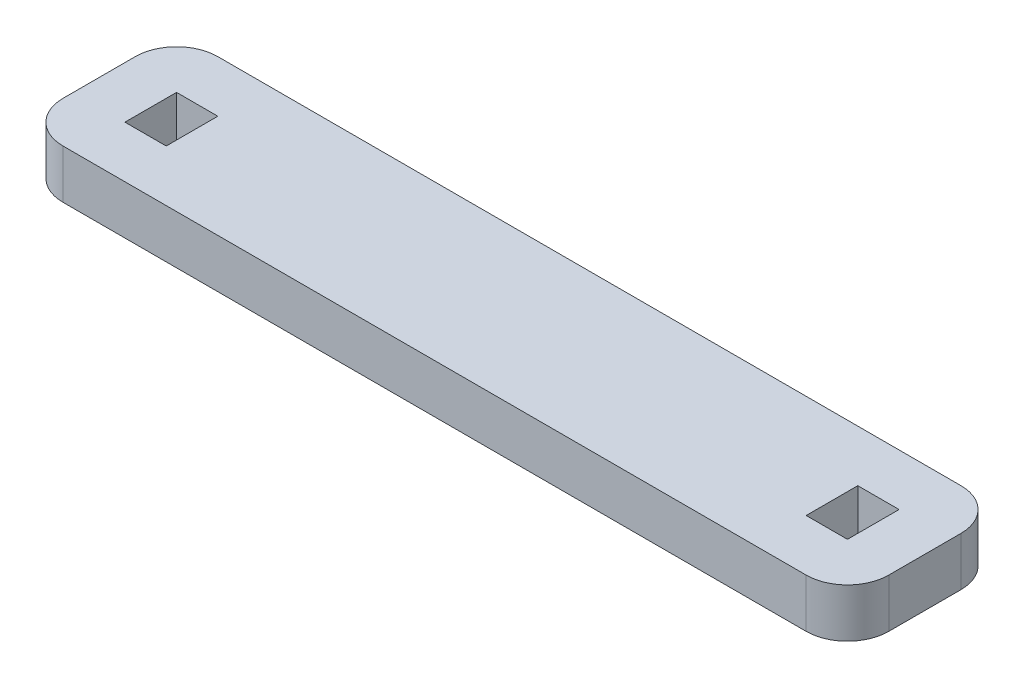
ISO-10303-21;
HEADER;
FILE_DESCRIPTION(('STEP AP214'),'2;1');
FILE_NAME('part.step','',(''),(''),'','','');
FILE_SCHEMA(('AUTOMOTIVE_DESIGN { 1 0 10303 214 1 1 1 1 }'));
ENDSEC;
DATA;
#1=APPLICATION_CONTEXT('core data for automotive mechanical design processes');
#2=APPLICATION_PROTOCOL_DEFINITION('international standard','automotive_design',2000,#1);
#3=PRODUCT_CONTEXT('',#1,'mechanical');
#4=PRODUCT('Part','Part','',(#3));
#5=PRODUCT_RELATED_PRODUCT_CATEGORY('part','',(#4));
#6=PRODUCT_DEFINITION_FORMATION('','',#4);
#7=PRODUCT_DEFINITION_CONTEXT('part definition',#1,'design');
#8=PRODUCT_DEFINITION('design','',#6,#7);
#9=PRODUCT_DEFINITION_SHAPE('','',#8);
#10=(LENGTH_UNIT() NAMED_UNIT(*) SI_UNIT(.MILLI.,.METRE.));
#11=(NAMED_UNIT(*) PLANE_ANGLE_UNIT() SI_UNIT($,.RADIAN.));
#12=(NAMED_UNIT(*) SI_UNIT($,.STERADIAN.) SOLID_ANGLE_UNIT());
#13=UNCERTAINTY_MEASURE_WITH_UNIT(LENGTH_MEASURE(1.E-05),#10,'distance_accuracy_value','');
#14=(GEOMETRIC_REPRESENTATION_CONTEXT(3) GLOBAL_UNCERTAINTY_ASSIGNED_CONTEXT((#13)) GLOBAL_UNIT_ASSIGNED_CONTEXT((#10,
#11,#12)) REPRESENTATION_CONTEXT('',''));
#15=CARTESIAN_POINT('',(0.,0.,0.));
#16=DIRECTION('',(0.,0.,1.));
#17=DIRECTION('',(1.,0.,0.));
#18=AXIS2_PLACEMENT_3D('',#15,#16,#17);
#19=CARTESIAN_POINT('',(0.,1.5,0.));
#20=DIRECTION('',(0.,1.,0.));
#21=DIRECTION('',(0.,0.,1.));
#22=AXIS2_PLACEMENT_3D('',#19,#20,#21);
#23=PLANE('',#22);
#24=DIRECTION('',(-1.,0.,0.));
#25=VECTOR('',#24,1.);
#26=CARTESIAN_POINT('',(25.4,1.5,-4.7625));
#27=LINE('',#26,#25);
#28=CARTESIAN_POINT('',(22.86,1.5,-4.7625));
#29=VERTEX_POINT('',#28);
#30=CARTESIAN_POINT('',(-22.86,1.5,-4.7625));
#31=VERTEX_POINT('',#30);
#32=EDGE_CURVE('E268',#29,#31,#27,.T.);
#33=ORIENTED_EDGE('',*,*,#32,.T.);
#34=CARTESIAN_POINT('',(-22.86,1.5,-2.2225));
#35=DIRECTION('',(0.,1.,0.));
#36=DIRECTION('',(0.,0.,1.));
#37=AXIS2_PLACEMENT_3D('',#34,#35,#36);
#38=CIRCLE('',#37,2.54);
#39=CARTESIAN_POINT('',(-25.4,1.5,-2.2225));
#40=VERTEX_POINT('',#39);
#41=EDGE_CURVE('E319',#31,#40,#38,.T.);
#42=ORIENTED_EDGE('',*,*,#41,.T.);
#43=DIRECTION('',(0.,0.,1.));
#44=VECTOR('',#43,1.);
#45=CARTESIAN_POINT('',(-25.4,1.5,4.7625));
#46=LINE('',#45,#44);
#47=CARTESIAN_POINT('',(-25.4,1.5,2.2225));
#48=VERTEX_POINT('',#47);
#49=EDGE_CURVE('E257',#40,#48,#46,.T.);
#50=ORIENTED_EDGE('',*,*,#49,.T.);
#51=CARTESIAN_POINT('',(-22.86,1.5,2.2225));
#52=DIRECTION('',(0.,1.,0.));
#53=DIRECTION('',(0.,0.,1.));
#54=AXIS2_PLACEMENT_3D('',#51,#52,#53);
#55=CIRCLE('',#54,2.54);
#56=CARTESIAN_POINT('',(-22.86,1.5,4.7625));
#57=VERTEX_POINT('',#56);
#58=EDGE_CURVE('E311',#48,#57,#55,.T.);
#59=ORIENTED_EDGE('',*,*,#58,.T.);
#60=DIRECTION('',(1.,0.,0.));
#61=VECTOR('',#60,1.);
#62=CARTESIAN_POINT('',(25.4,1.5,4.7625));
#63=LINE('',#62,#61);
#64=CARTESIAN_POINT('',(22.86,1.5,4.7625));
#65=VERTEX_POINT('',#64);
#66=EDGE_CURVE('E261',#57,#65,#63,.T.);
#67=ORIENTED_EDGE('',*,*,#66,.T.);
#68=CARTESIAN_POINT('',(22.86,1.5,2.2225));
#69=DIRECTION('',(0.,1.,0.));
#70=DIRECTION('',(0.,0.,1.));
#71=AXIS2_PLACEMENT_3D('',#68,#69,#70);
#72=CIRCLE('',#71,2.54);
#73=CARTESIAN_POINT('',(25.4,1.5,2.2225));
#74=VERTEX_POINT('',#73);
#75=EDGE_CURVE('E68',#65,#74,#72,.T.);
#76=ORIENTED_EDGE('',*,*,#75,.T.);
#77=DIRECTION('',(0.,0.,-1.));
#78=VECTOR('',#77,1.);
#79=CARTESIAN_POINT('',(25.4,1.5,4.7625));
#80=LINE('',#79,#78);
#81=CARTESIAN_POINT('',(25.4,1.5,-2.2225));
#82=VERTEX_POINT('',#81);
#83=EDGE_CURVE('E265',#74,#82,#80,.T.);
#84=ORIENTED_EDGE('',*,*,#83,.T.);
#85=CARTESIAN_POINT('',(22.86,1.5,-2.2225));
#86=DIRECTION('',(0.,1.,0.));
#87=DIRECTION('',(0.,0.,1.));
#88=AXIS2_PLACEMENT_3D('',#85,#86,#87);
#89=CIRCLE('',#88,2.54);
#90=EDGE_CURVE('E316',#82,#29,#89,.T.);
#91=ORIENTED_EDGE('',*,*,#90,.T.);
#92=EDGE_LOOP('',(#33,#42,#50,#59,#67,#76,#84,#91));
#93=FACE_BOUND('',#92,.T.);
#94=DIRECTION('',(1.,0.,0.));
#95=VECTOR('',#94,1.);
#96=CARTESIAN_POINT('',(-19.685,1.5,1.5875));
#97=LINE('',#96,#95);
#98=CARTESIAN_POINT('',(-22.225,1.5,1.5875));
#99=VERTEX_POINT('',#98);
#100=CARTESIAN_POINT('',(-19.685,1.5,1.5875));
#101=VERTEX_POINT('',#100);
#102=EDGE_CURVE('E217',#99,#101,#97,.T.);
#103=ORIENTED_EDGE('',*,*,#102,.F.);
#104=DIRECTION('',(0.,0.,1.));
#105=VECTOR('',#104,1.);
#106=CARTESIAN_POINT('',(-22.225,1.5,1.5875));
#107=LINE('',#106,#105);
#108=CARTESIAN_POINT('',(-22.225,1.5,-1.5875));
#109=VERTEX_POINT('',#108);
#110=EDGE_CURVE('E214',#109,#99,#107,.T.);
#111=ORIENTED_EDGE('',*,*,#110,.F.);
#112=DIRECTION('',(-1.,0.,0.));
#113=VECTOR('',#112,1.);
#114=CARTESIAN_POINT('',(-19.685,1.5,-1.5875));
#115=LINE('',#114,#113);
#116=CARTESIAN_POINT('',(-19.685,1.5,-1.5875));
#117=VERTEX_POINT('',#116);
#118=EDGE_CURVE('E225',#117,#109,#115,.T.);
#119=ORIENTED_EDGE('',*,*,#118,.F.);
#120=DIRECTION('',(0.,0.,-1.));
#121=VECTOR('',#120,1.);
#122=CARTESIAN_POINT('',(-19.685,1.5,1.5875));
#123=LINE('',#122,#121);
#124=EDGE_CURVE('E221',#101,#117,#123,.T.);
#125=ORIENTED_EDGE('',*,*,#124,.F.);
#126=EDGE_LOOP('',(#103,#111,#119,#125));
#127=FACE_BOUND('',#126,.T.);
#128=DIRECTION('',(1.,0.,0.));
#129=VECTOR('',#128,1.);
#130=CARTESIAN_POINT('',(22.225,1.5,1.5875));
#131=LINE('',#130,#129);
#132=CARTESIAN_POINT('',(19.685,1.5,1.5875));
#133=VERTEX_POINT('',#132);
#134=CARTESIAN_POINT('',(22.225,1.5,1.5875));
#135=VERTEX_POINT('',#134);
#136=EDGE_CURVE('E172',#133,#135,#131,.T.);
#137=ORIENTED_EDGE('',*,*,#136,.F.);
#138=DIRECTION('',(0.,0.,1.));
#139=VECTOR('',#138,1.);
#140=CARTESIAN_POINT('',(19.685,1.5,1.5875));
#141=LINE('',#140,#139);
#142=CARTESIAN_POINT('',(19.685,1.5,-1.5875));
#143=VERTEX_POINT('',#142);
#144=EDGE_CURVE('E161',#143,#133,#141,.T.);
#145=ORIENTED_EDGE('',*,*,#144,.F.);
#146=DIRECTION('',(-1.,0.,0.));
#147=VECTOR('',#146,1.);
#148=CARTESIAN_POINT('',(22.225,1.5,-1.5875));
#149=LINE('',#148,#147);
#150=CARTESIAN_POINT('',(22.225,1.5,-1.5875));
#151=VERTEX_POINT('',#150);
#152=EDGE_CURVE('E190',#151,#143,#149,.T.);
#153=ORIENTED_EDGE('',*,*,#152,.F.);
#154=DIRECTION('',(0.,0.,-1.));
#155=VECTOR('',#154,1.);
#156=CARTESIAN_POINT('',(22.225,1.5,1.5875));
#157=LINE('',#156,#155);
#158=EDGE_CURVE('E186',#135,#151,#157,.T.);
#159=ORIENTED_EDGE('',*,*,#158,.F.);
#160=EDGE_LOOP('',(#137,#145,#153,#159));
#161=FACE_BOUND('',#160,.T.);
#162=ADVANCED_FACE('F45',(#93,#127,#161),#23,.T.);
#163=CARTESIAN_POINT('',(0.,-1.5,0.));
#164=DIRECTION('',(0.,1.,0.));
#165=DIRECTION('',(0.,0.,1.));
#166=AXIS2_PLACEMENT_3D('',#163,#164,#165);
#167=PLANE('',#166);
#168=DIRECTION('',(0.,0.,1.));
#169=VECTOR('',#168,1.);
#170=CARTESIAN_POINT('',(-22.225,-1.5,1.5875));
#171=LINE('',#170,#169);
#172=CARTESIAN_POINT('',(-22.225,-1.5,-1.5875));
#173=VERTEX_POINT('',#172);
#174=CARTESIAN_POINT('',(-22.225,-1.5,1.5875));
#175=VERTEX_POINT('',#174);
#176=EDGE_CURVE('E181',#173,#175,#171,.T.);
#177=ORIENTED_EDGE('',*,*,#176,.T.);
#178=DIRECTION('',(1.,0.,0.));
#179=VECTOR('',#178,1.);
#180=CARTESIAN_POINT('',(-19.685,-1.5,1.5875));
#181=LINE('',#180,#179);
#182=CARTESIAN_POINT('',(-19.685,-1.5,1.5875));
#183=VERTEX_POINT('',#182);
#184=EDGE_CURVE('E232',#175,#183,#181,.T.);
#185=ORIENTED_EDGE('',*,*,#184,.T.);
#186=DIRECTION('',(0.,0.,-1.));
#187=VECTOR('',#186,1.);
#188=CARTESIAN_POINT('',(-19.685,-1.5,1.5875));
#189=LINE('',#188,#187);
#190=CARTESIAN_POINT('',(-19.685,-1.5,-1.5875));
#191=VERTEX_POINT('',#190);
#192=EDGE_CURVE('E236',#183,#191,#189,.T.);
#193=ORIENTED_EDGE('',*,*,#192,.T.);
#194=DIRECTION('',(-1.,0.,0.));
#195=VECTOR('',#194,1.);
#196=CARTESIAN_POINT('',(-19.685,-1.5,-1.5875));
#197=LINE('',#196,#195);
#198=EDGE_CURVE('E218',#191,#173,#197,.T.);
#199=ORIENTED_EDGE('',*,*,#198,.T.);
#200=EDGE_LOOP('',(#177,#185,#193,#199));
#201=FACE_BOUND('',#200,.T.);
#202=DIRECTION('',(0.,0.,1.));
#203=VECTOR('',#202,1.);
#204=CARTESIAN_POINT('',(-25.4,-1.5,4.7625));
#205=LINE('',#204,#203);
#206=CARTESIAN_POINT('',(-25.4,-1.5,-2.2225));
#207=VERTEX_POINT('',#206);
#208=CARTESIAN_POINT('',(-25.4,-1.5,2.2225));
#209=VERTEX_POINT('',#208);
#210=EDGE_CURVE('E256',#207,#209,#205,.T.);
#211=ORIENTED_EDGE('',*,*,#210,.F.);
#212=CARTESIAN_POINT('',(-22.86,-1.5,-2.2225));
#213=DIRECTION('',(0.,1.,0.));
#214=DIRECTION('',(0.,0.,1.));
#215=AXIS2_PLACEMENT_3D('',#212,#213,#214);
#216=CIRCLE('',#215,2.54);
#217=CARTESIAN_POINT('',(-22.86,-1.5,-4.7625));
#218=VERTEX_POINT('',#217);
#219=EDGE_CURVE('E301',#207,#218,#216,.F.);
#220=ORIENTED_EDGE('',*,*,#219,.T.);
#221=DIRECTION('',(-1.,0.,0.));
#222=VECTOR('',#221,1.);
#223=CARTESIAN_POINT('',(25.4,-1.5,-4.7625));
#224=LINE('',#223,#222);
#225=CARTESIAN_POINT('',(22.86,-1.5,-4.7625));
#226=VERTEX_POINT('',#225);
#227=EDGE_CURVE('E262',#226,#218,#224,.T.);
#228=ORIENTED_EDGE('',*,*,#227,.F.);
#229=CARTESIAN_POINT('',(22.86,-1.5,-2.2225));
#230=DIRECTION('',(0.,1.,0.));
#231=DIRECTION('',(0.,0.,1.));
#232=AXIS2_PLACEMENT_3D('',#229,#230,#231);
#233=CIRCLE('',#232,2.54);
#234=CARTESIAN_POINT('',(25.4,-1.5,-2.2225));
#235=VERTEX_POINT('',#234);
#236=EDGE_CURVE('E298',#226,#235,#233,.F.);
#237=ORIENTED_EDGE('',*,*,#236,.T.);
#238=DIRECTION('',(0.,0.,-1.));
#239=VECTOR('',#238,1.);
#240=CARTESIAN_POINT('',(25.4,-1.5,4.7625));
#241=LINE('',#240,#239);
#242=CARTESIAN_POINT('',(25.4,-1.5,2.2225));
#243=VERTEX_POINT('',#242);
#244=EDGE_CURVE('E280',#243,#235,#241,.T.);
#245=ORIENTED_EDGE('',*,*,#244,.F.);
#246=CARTESIAN_POINT('',(22.86,-1.5,2.2225));
#247=DIRECTION('',(0.,1.,0.));
#248=DIRECTION('',(0.,0.,1.));
#249=AXIS2_PLACEMENT_3D('',#246,#247,#248);
#250=CIRCLE('',#249,2.54);
#251=CARTESIAN_POINT('',(22.86,-1.5,4.7625));
#252=VERTEX_POINT('',#251);
#253=EDGE_CURVE('E295',#243,#252,#250,.F.);
#254=ORIENTED_EDGE('',*,*,#253,.T.);
#255=DIRECTION('',(1.,0.,0.));
#256=VECTOR('',#255,1.);
#257=CARTESIAN_POINT('',(25.4,-1.5,4.7625));
#258=LINE('',#257,#256);
#259=CARTESIAN_POINT('',(-22.86,-1.5,4.7625));
#260=VERTEX_POINT('',#259);
#261=EDGE_CURVE('E276',#260,#252,#258,.T.);
#262=ORIENTED_EDGE('',*,*,#261,.F.);
#263=CARTESIAN_POINT('',(-22.86,-1.5,2.2225));
#264=DIRECTION('',(0.,1.,0.));
#265=DIRECTION('',(0.,0.,1.));
#266=AXIS2_PLACEMENT_3D('',#263,#264,#265);
#267=CIRCLE('',#266,2.54);
#268=EDGE_CURVE('E292',#260,#209,#267,.F.);
#269=ORIENTED_EDGE('',*,*,#268,.T.);
#270=EDGE_LOOP('',(#211,#220,#228,#237,#245,#254,#262,#269));
#271=FACE_BOUND('',#270,.T.);
#272=DIRECTION('',(0.,0.,1.));
#273=VECTOR('',#272,1.);
#274=CARTESIAN_POINT('',(19.685,-1.5,1.5875));
#275=LINE('',#274,#273);
#276=CARTESIAN_POINT('',(19.685,-1.5,-1.5875));
#277=VERTEX_POINT('',#276);
#278=CARTESIAN_POINT('',(19.685,-1.5,1.5875));
#279=VERTEX_POINT('',#278);
#280=EDGE_CURVE('E195',#277,#279,#275,.T.);
#281=ORIENTED_EDGE('',*,*,#280,.T.);
#282=DIRECTION('',(1.,0.,0.));
#283=VECTOR('',#282,1.);
#284=CARTESIAN_POINT('',(22.225,-1.5,1.5875));
#285=LINE('',#284,#283);
#286=CARTESIAN_POINT('',(22.225,-1.5,1.5875));
#287=VERTEX_POINT('',#286);
#288=EDGE_CURVE('E179',#279,#287,#285,.T.);
#289=ORIENTED_EDGE('',*,*,#288,.T.);
#290=DIRECTION('',(0.,0.,-1.));
#291=VECTOR('',#290,1.);
#292=CARTESIAN_POINT('',(22.225,-1.5,1.5875));
#293=LINE('',#292,#291);
#294=CARTESIAN_POINT('',(22.225,-1.5,-1.5875));
#295=VERTEX_POINT('',#294);
#296=EDGE_CURVE('E200',#287,#295,#293,.T.);
#297=ORIENTED_EDGE('',*,*,#296,.T.);
#298=DIRECTION('',(-1.,0.,0.));
#299=VECTOR('',#298,1.);
#300=CARTESIAN_POINT('',(22.225,-1.5,-1.5875));
#301=LINE('',#300,#299);
#302=EDGE_CURVE('E173',#295,#277,#301,.T.);
#303=ORIENTED_EDGE('',*,*,#302,.T.);
#304=EDGE_LOOP('',(#281,#289,#297,#303));
#305=FACE_BOUND('',#304,.T.);
#306=ADVANCED_FACE('F339',(#201,#271,#305),#167,.F.);
#307=CARTESIAN_POINT('',(-25.4,1.5,4.7625));
#308=DIRECTION('',(1.,0.,0.));
#309=DIRECTION('',(0.,0.,-1.));
#310=AXIS2_PLACEMENT_3D('',#307,#308,#309);
#311=PLANE('',#310);
#312=ORIENTED_EDGE('',*,*,#49,.F.);
#313=DIRECTION('',(0.,-1.,0.));
#314=VECTOR('',#313,1.);
#315=CARTESIAN_POINT('',(-25.4,1.5,-2.2225));
#316=LINE('',#315,#314);
#317=EDGE_CURVE('E288',#40,#207,#316,.T.);
#318=ORIENTED_EDGE('',*,*,#317,.T.);
#319=ORIENTED_EDGE('',*,*,#210,.T.);
#320=DIRECTION('',(0.,-1.,0.));
#321=VECTOR('',#320,1.);
#322=CARTESIAN_POINT('',(-25.4,1.5,2.2225));
#323=LINE('',#322,#321);
#324=EDGE_CURVE('E272',#209,#48,#323,.F.);
#325=ORIENTED_EDGE('',*,*,#324,.T.);
#326=EDGE_LOOP('',(#312,#318,#319,#325));
#327=FACE_BOUND('',#326,.T.);
#328=ADVANCED_FACE('F362',(#327),#311,.F.);
#329=CARTESIAN_POINT('',(25.4,1.5,4.7625));
#330=DIRECTION('',(0.,0.,-1.));
#331=DIRECTION('',(-1.,0.,0.));
#332=AXIS2_PLACEMENT_3D('',#329,#330,#331);
#333=PLANE('',#332);
#334=ORIENTED_EDGE('',*,*,#261,.T.);
#335=DIRECTION('',(0.,-1.,0.));
#336=VECTOR('',#335,1.);
#337=CARTESIAN_POINT('',(22.86,1.5,4.7625));
#338=LINE('',#337,#336);
#339=EDGE_CURVE('E11',#252,#65,#338,.F.);
#340=ORIENTED_EDGE('',*,*,#339,.T.);
#341=ORIENTED_EDGE('',*,*,#66,.F.);
#342=DIRECTION('',(0.,-1.,0.));
#343=VECTOR('',#342,1.);
#344=CARTESIAN_POINT('',(-22.86,1.5,4.7625));
#345=LINE('',#344,#343);
#346=EDGE_CURVE('E54',#57,#260,#345,.T.);
#347=ORIENTED_EDGE('',*,*,#346,.T.);
#348=EDGE_LOOP('',(#334,#340,#341,#347));
#349=FACE_BOUND('',#348,.T.);
#350=ADVANCED_FACE('F333',(#349),#333,.F.);
#351=CARTESIAN_POINT('',(25.4,1.5,4.7625));
#352=DIRECTION('',(-1.,0.,0.));
#353=DIRECTION('',(0.,0.,1.));
#354=AXIS2_PLACEMENT_3D('',#351,#352,#353);
#355=PLANE('',#354);
#356=ORIENTED_EDGE('',*,*,#244,.T.);
#357=DIRECTION('',(0.,-1.,0.));
#358=VECTOR('',#357,1.);
#359=CARTESIAN_POINT('',(25.4,1.5,-2.2225));
#360=LINE('',#359,#358);
#361=EDGE_CURVE('E61',#235,#82,#360,.F.);
#362=ORIENTED_EDGE('',*,*,#361,.T.);
#363=ORIENTED_EDGE('',*,*,#83,.F.);
#364=DIRECTION('',(0.,-1.,0.));
#365=VECTOR('',#364,1.);
#366=CARTESIAN_POINT('',(25.4,1.5,2.2225));
#367=LINE('',#366,#365);
#368=EDGE_CURVE('E322',#74,#243,#367,.T.);
#369=ORIENTED_EDGE('',*,*,#368,.T.);
#370=EDGE_LOOP('',(#356,#362,#363,#369));
#371=FACE_BOUND('',#370,.T.);
#372=ADVANCED_FACE('F345',(#371),#355,.F.);
#373=CARTESIAN_POINT('',(25.4,1.5,-4.7625));
#374=DIRECTION('',(0.,0.,1.));
#375=DIRECTION('',(1.,0.,0.));
#376=AXIS2_PLACEMENT_3D('',#373,#374,#375);
#377=PLANE('',#376);
#378=ORIENTED_EDGE('',*,*,#227,.T.);
#379=DIRECTION('',(0.,-1.,0.));
#380=VECTOR('',#379,1.);
#381=CARTESIAN_POINT('',(-22.86,1.5,-4.7625));
#382=LINE('',#381,#380);
#383=EDGE_CURVE('E308',#218,#31,#382,.F.);
#384=ORIENTED_EDGE('',*,*,#383,.T.);
#385=ORIENTED_EDGE('',*,*,#32,.F.);
#386=DIRECTION('',(0.,-1.,0.));
#387=VECTOR('',#386,1.);
#388=CARTESIAN_POINT('',(22.86,1.5,-4.7625));
#389=LINE('',#388,#387);
#390=EDGE_CURVE('E304',#29,#226,#389,.T.);
#391=ORIENTED_EDGE('',*,*,#390,.T.);
#392=EDGE_LOOP('',(#378,#384,#385,#391));
#393=FACE_BOUND('',#392,.T.);
#394=ADVANCED_FACE('F354',(#393),#377,.F.);
#395=CARTESIAN_POINT('',(-22.225,1.5,1.5875));
#396=DIRECTION('',(1.,0.,0.));
#397=DIRECTION('',(0.,0.,-1.));
#398=AXIS2_PLACEMENT_3D('',#395,#396,#397);
#399=PLANE('',#398);
#400=ORIENTED_EDGE('',*,*,#176,.F.);
#401=DIRECTION('',(0.,-1.,0.));
#402=VECTOR('',#401,1.);
#403=CARTESIAN_POINT('',(-22.225,1.5,-1.5875));
#404=LINE('',#403,#402);
#405=EDGE_CURVE('E228',#109,#173,#404,.T.);
#406=ORIENTED_EDGE('',*,*,#405,.F.);
#407=ORIENTED_EDGE('',*,*,#110,.T.);
#408=DIRECTION('',(0.,-1.,0.));
#409=VECTOR('',#408,1.);
#410=CARTESIAN_POINT('',(-22.225,1.5,1.5875));
#411=LINE('',#410,#409);
#412=EDGE_CURVE('E252',#99,#175,#411,.T.);
#413=ORIENTED_EDGE('',*,*,#412,.T.);
#414=EDGE_LOOP('',(#400,#406,#407,#413));
#415=FACE_BOUND('',#414,.T.);
#416=ADVANCED_FACE('F377',(#415),#399,.T.);
#417=CARTESIAN_POINT('',(-19.685,1.5,1.5875));
#418=DIRECTION('',(0.,0.,-1.));
#419=DIRECTION('',(-1.,0.,0.));
#420=AXIS2_PLACEMENT_3D('',#417,#418,#419);
#421=PLANE('',#420);
#422=ORIENTED_EDGE('',*,*,#184,.F.);
#423=ORIENTED_EDGE('',*,*,#412,.F.);
#424=ORIENTED_EDGE('',*,*,#102,.T.);
#425=DIRECTION('',(0.,-1.,0.));
#426=VECTOR('',#425,1.);
#427=CARTESIAN_POINT('',(-19.685,1.5,1.5875));
#428=LINE('',#427,#426);
#429=EDGE_CURVE('E249',#101,#183,#428,.T.);
#430=ORIENTED_EDGE('',*,*,#429,.T.);
#431=EDGE_LOOP('',(#422,#423,#424,#430));
#432=FACE_BOUND('',#431,.T.);
#433=ADVANCED_FACE('F459',(#432),#421,.T.);
#434=CARTESIAN_POINT('',(-19.685,1.5,1.5875));
#435=DIRECTION('',(-1.,0.,0.));
#436=DIRECTION('',(0.,0.,1.));
#437=AXIS2_PLACEMENT_3D('',#434,#435,#436);
#438=PLANE('',#437);
#439=ORIENTED_EDGE('',*,*,#192,.F.);
#440=ORIENTED_EDGE('',*,*,#429,.F.);
#441=ORIENTED_EDGE('',*,*,#124,.T.);
#442=DIRECTION('',(0.,-1.,0.));
#443=VECTOR('',#442,1.);
#444=CARTESIAN_POINT('',(-19.685,1.5,-1.5875));
#445=LINE('',#444,#443);
#446=EDGE_CURVE('E246',#117,#191,#445,.T.);
#447=ORIENTED_EDGE('',*,*,#446,.T.);
#448=EDGE_LOOP('',(#439,#440,#441,#447));
#449=FACE_BOUND('',#448,.T.);
#450=ADVANCED_FACE('F450',(#449),#438,.T.);
#451=CARTESIAN_POINT('',(-19.685,1.5,-1.5875));
#452=DIRECTION('',(0.,0.,1.));
#453=DIRECTION('',(1.,0.,0.));
#454=AXIS2_PLACEMENT_3D('',#451,#452,#453);
#455=PLANE('',#454);
#456=ORIENTED_EDGE('',*,*,#198,.F.);
#457=ORIENTED_EDGE('',*,*,#446,.F.);
#458=ORIENTED_EDGE('',*,*,#118,.T.);
#459=ORIENTED_EDGE('',*,*,#405,.T.);
#460=EDGE_LOOP('',(#456,#457,#458,#459));
#461=FACE_BOUND('',#460,.T.);
#462=ADVANCED_FACE('F442',(#461),#455,.T.);
#463=CARTESIAN_POINT('',(19.685,1.5,1.5875));
#464=DIRECTION('',(1.,0.,0.));
#465=DIRECTION('',(0.,0.,-1.));
#466=AXIS2_PLACEMENT_3D('',#463,#464,#465);
#467=PLANE('',#466);
#468=ORIENTED_EDGE('',*,*,#280,.F.);
#469=DIRECTION('',(0.,-1.,0.));
#470=VECTOR('',#469,1.);
#471=CARTESIAN_POINT('',(19.685,1.5,-1.5875));
#472=LINE('',#471,#470);
#473=EDGE_CURVE('E167',#143,#277,#472,.T.);
#474=ORIENTED_EDGE('',*,*,#473,.F.);
#475=ORIENTED_EDGE('',*,*,#144,.T.);
#476=DIRECTION('',(0.,-1.,0.));
#477=VECTOR('',#476,1.);
#478=CARTESIAN_POINT('',(19.685,1.5,1.5875));
#479=LINE('',#478,#477);
#480=EDGE_CURVE('E164',#133,#279,#479,.T.);
#481=ORIENTED_EDGE('',*,*,#480,.T.);
#482=EDGE_LOOP('',(#468,#474,#475,#481));
#483=FACE_BOUND('',#482,.T.);
#484=ADVANCED_FACE('F163',(#483),#467,.T.);
#485=CARTESIAN_POINT('',(22.225,1.5,1.5875));
#486=DIRECTION('',(0.,0.,-1.));
#487=DIRECTION('',(-1.,0.,0.));
#488=AXIS2_PLACEMENT_3D('',#485,#486,#487);
#489=PLANE('',#488);
#490=ORIENTED_EDGE('',*,*,#288,.F.);
#491=ORIENTED_EDGE('',*,*,#480,.F.);
#492=ORIENTED_EDGE('',*,*,#136,.T.);
#493=DIRECTION('',(0.,-1.,0.));
#494=VECTOR('',#493,1.);
#495=CARTESIAN_POINT('',(22.225,1.5,1.5875));
#496=LINE('',#495,#494);
#497=EDGE_CURVE('E182',#135,#287,#496,.T.);
#498=ORIENTED_EDGE('',*,*,#497,.T.);
#499=EDGE_LOOP('',(#490,#491,#492,#498));
#500=FACE_BOUND('',#499,.T.);
#501=ADVANCED_FACE('F176',(#500),#489,.T.);
#502=CARTESIAN_POINT('',(22.225,1.5,1.5875));
#503=DIRECTION('',(-1.,0.,0.));
#504=DIRECTION('',(0.,0.,1.));
#505=AXIS2_PLACEMENT_3D('',#502,#503,#504);
#506=PLANE('',#505);
#507=ORIENTED_EDGE('',*,*,#296,.F.);
#508=ORIENTED_EDGE('',*,*,#497,.F.);
#509=ORIENTED_EDGE('',*,*,#158,.T.);
#510=DIRECTION('',(0.,-1.,0.));
#511=VECTOR('',#510,1.);
#512=CARTESIAN_POINT('',(22.225,1.5,-1.5875));
#513=LINE('',#512,#511);
#514=EDGE_CURVE('E209',#151,#295,#513,.T.);
#515=ORIENTED_EDGE('',*,*,#514,.T.);
#516=EDGE_LOOP('',(#507,#508,#509,#515));
#517=FACE_BOUND('',#516,.T.);
#518=ADVANCED_FACE('F418',(#517),#506,.T.);
#519=CARTESIAN_POINT('',(22.225,1.5,-1.5875));
#520=DIRECTION('',(0.,0.,1.));
#521=DIRECTION('',(1.,0.,0.));
#522=AXIS2_PLACEMENT_3D('',#519,#520,#521);
#523=PLANE('',#522);
#524=ORIENTED_EDGE('',*,*,#302,.F.);
#525=ORIENTED_EDGE('',*,*,#514,.F.);
#526=ORIENTED_EDGE('',*,*,#152,.T.);
#527=ORIENTED_EDGE('',*,*,#473,.T.);
#528=EDGE_LOOP('',(#524,#525,#526,#527));
#529=FACE_BOUND('',#528,.T.);
#530=ADVANCED_FACE('F390',(#529),#523,.T.);
#531=CARTESIAN_POINT('',(-22.86,1.5,-2.2225));
#532=DIRECTION('',(0.,-1.,0.));
#533=DIRECTION('',(0.,0.,-1.));
#534=AXIS2_PLACEMENT_3D('',#531,#532,#533);
#535=CYLINDRICAL_SURFACE('',#534,2.54);
#536=ORIENTED_EDGE('',*,*,#41,.F.);
#537=ORIENTED_EDGE('',*,*,#383,.F.);
#538=ORIENTED_EDGE('',*,*,#219,.F.);
#539=ORIENTED_EDGE('',*,*,#317,.F.);
#540=EDGE_LOOP('',(#536,#537,#538,#539));
#541=FACE_BOUND('',#540,.T.);
#542=ADVANCED_FACE('F359',(#541),#535,.T.);
#543=CARTESIAN_POINT('',(22.86,1.5,-2.2225));
#544=DIRECTION('',(0.,-1.,0.));
#545=DIRECTION('',(0.,0.,-1.));
#546=AXIS2_PLACEMENT_3D('',#543,#544,#545);
#547=CYLINDRICAL_SURFACE('',#546,2.54);
#548=ORIENTED_EDGE('',*,*,#90,.F.);
#549=ORIENTED_EDGE('',*,*,#361,.F.);
#550=ORIENTED_EDGE('',*,*,#236,.F.);
#551=ORIENTED_EDGE('',*,*,#390,.F.);
#552=EDGE_LOOP('',(#548,#549,#550,#551));
#553=FACE_BOUND('',#552,.T.);
#554=ADVANCED_FACE('F351',(#553),#547,.T.);
#555=CARTESIAN_POINT('',(22.86,1.5,2.2225));
#556=DIRECTION('',(0.,-1.,0.));
#557=DIRECTION('',(0.,0.,-1.));
#558=AXIS2_PLACEMENT_3D('',#555,#556,#557);
#559=CYLINDRICAL_SURFACE('',#558,2.54);
#560=ORIENTED_EDGE('',*,*,#75,.F.);
#561=ORIENTED_EDGE('',*,*,#339,.F.);
#562=ORIENTED_EDGE('',*,*,#253,.F.);
#563=ORIENTED_EDGE('',*,*,#368,.F.);
#564=EDGE_LOOP('',(#560,#561,#562,#563));
#565=FACE_BOUND('',#564,.T.);
#566=ADVANCED_FACE('F344',(#565),#559,.T.);
#567=CARTESIAN_POINT('',(-22.86,1.5,2.2225));
#568=DIRECTION('',(0.,-1.,0.));
#569=DIRECTION('',(0.,0.,-1.));
#570=AXIS2_PLACEMENT_3D('',#567,#568,#569);
#571=CYLINDRICAL_SURFACE('',#570,2.54);
#572=ORIENTED_EDGE('',*,*,#58,.F.);
#573=ORIENTED_EDGE('',*,*,#324,.F.);
#574=ORIENTED_EDGE('',*,*,#268,.F.);
#575=ORIENTED_EDGE('',*,*,#346,.F.);
#576=EDGE_LOOP('',(#572,#573,#574,#575));
#577=FACE_BOUND('',#576,.T.);
#578=ADVANCED_FACE('F47',(#577),#571,.T.);
#579=CLOSED_SHELL('',(#162,#306,#328,#350,#372,#394,#416,#433,#450,#462,#484,#501,#518,#530,
#542,#554,#566,#578));
#580=MANIFOLD_SOLID_BREP('B2',#579);
#581=ADVANCED_BREP_SHAPE_REPRESENTATION('',(#18,#580),#14);
#582=SHAPE_DEFINITION_REPRESENTATION(#9,#581);
ENDSEC;
END-ISO-10303-21;
